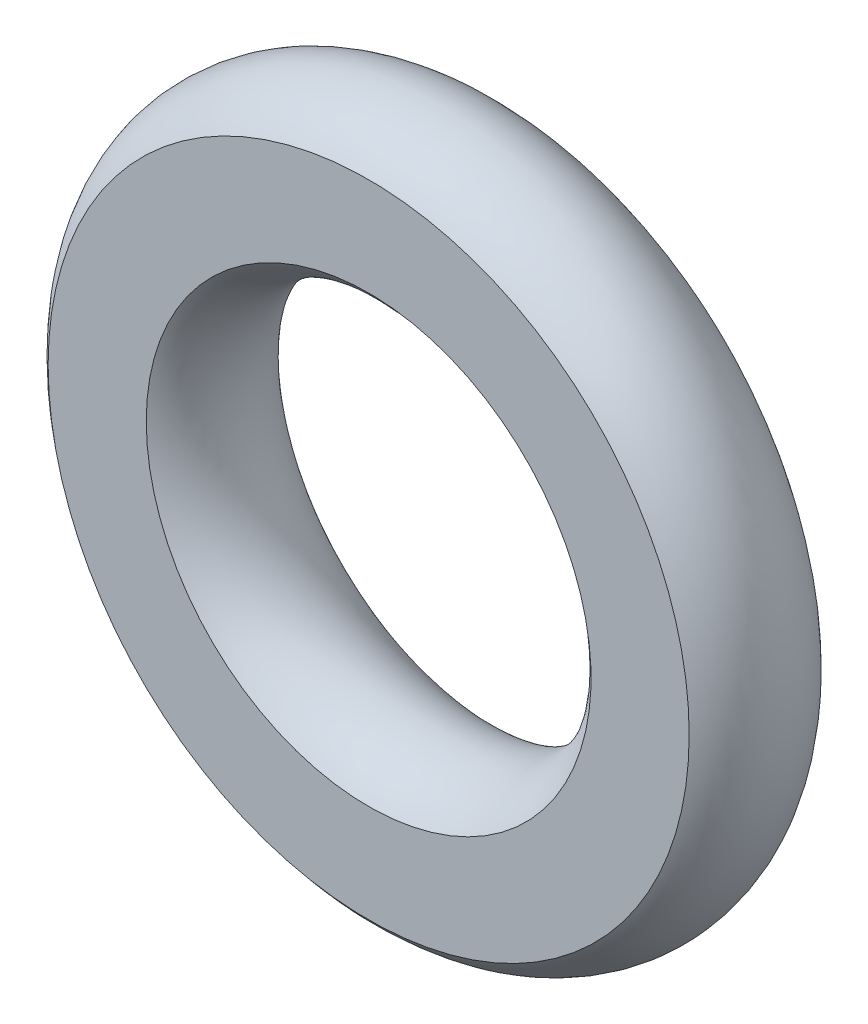
ISO-10303-21;
HEADER;
FILE_DESCRIPTION(('STEP AP214'),'2;1');
FILE_NAME('part.step','',(''),(''),'','','');
FILE_SCHEMA(('AUTOMOTIVE_DESIGN { 1 0 10303 214 1 1 1 1 }'));
ENDSEC;
DATA;
#1=APPLICATION_CONTEXT('core data for automotive mechanical design processes');
#2=APPLICATION_PROTOCOL_DEFINITION('international standard','automotive_design',2000,#1);
#3=PRODUCT_CONTEXT('',#1,'mechanical');
#4=PRODUCT('Part','Part','',(#3));
#5=PRODUCT_RELATED_PRODUCT_CATEGORY('part','',(#4));
#6=PRODUCT_DEFINITION_FORMATION('','',#4);
#7=PRODUCT_DEFINITION_CONTEXT('part definition',#1,'design');
#8=PRODUCT_DEFINITION('design','',#6,#7);
#9=PRODUCT_DEFINITION_SHAPE('','',#8);
#10=(LENGTH_UNIT() NAMED_UNIT(*) SI_UNIT(.MILLI.,.METRE.));
#11=(NAMED_UNIT(*) PLANE_ANGLE_UNIT() SI_UNIT($,.RADIAN.));
#12=(NAMED_UNIT(*) SI_UNIT($,.STERADIAN.) SOLID_ANGLE_UNIT());
#13=UNCERTAINTY_MEASURE_WITH_UNIT(LENGTH_MEASURE(1.E-05),#10,'distance_accuracy_value','');
#14=(GEOMETRIC_REPRESENTATION_CONTEXT(3) GLOBAL_UNCERTAINTY_ASSIGNED_CONTEXT((#13)) GLOBAL_UNIT_ASSIGNED_CONTEXT((#10,
#11,#12)) REPRESENTATION_CONTEXT('',''));
#15=CARTESIAN_POINT('',(0.,0.,0.));
#16=DIRECTION('',(0.,0.,1.));
#17=DIRECTION('',(1.,0.,0.));
#18=AXIS2_PLACEMENT_3D('',#15,#16,#17);
#19=CARTESIAN_POINT('',(0.,0.,0.));
#20=DIRECTION('',(0.,0.,-1.));
#21=DIRECTION('',(-1.,0.,0.));
#22=AXIS2_PLACEMENT_3D('',#19,#20,#21);
#23=TOROIDAL_SURFACE('',#22,2.1082,0.635);
#24=CARTESIAN_POINT('',(0.,0.,0.508));
#25=DIRECTION('',(0.,0.,-1.));
#26=DIRECTION('',(-1.,0.,0.));
#27=AXIS2_PLACEMENT_3D('',#24,#25,#26);
#28=CIRCLE('',#27,1.7272);
#29=CARTESIAN_POINT('',(-1.7272,0.,0.508));
#30=VERTEX_POINT('',#29);
#31=EDGE_CURVE('E49',#30,#30,#28,.T.);
#32=ORIENTED_EDGE('',*,*,#31,.F.);
#33=EDGE_LOOP('',(#32));
#34=FACE_BOUND('',#33,.T.);
#35=CARTESIAN_POINT('',(0.,0.,0.508));
#36=DIRECTION('',(0.,0.,1.));
#37=DIRECTION('',(1.,0.,0.));
#38=AXIS2_PLACEMENT_3D('',#35,#36,#37);
#39=CIRCLE('',#38,2.4892);
#40=CARTESIAN_POINT('',(2.4892,0.,0.508));
#41=VERTEX_POINT('',#40);
#42=EDGE_CURVE('E10',#41,#41,#39,.T.);
#43=ORIENTED_EDGE('',*,*,#42,.F.);
#44=EDGE_LOOP('',(#43));
#45=FACE_BOUND('',#44,.T.);
#46=ADVANCED_FACE('F42',(#34,#45),#23,.T.);
#47=CARTESIAN_POINT('',(0.,0.,0.508));
#48=DIRECTION('',(0.,0.,1.));
#49=DIRECTION('',(1.,0.,0.));
#50=AXIS2_PLACEMENT_3D('',#47,#48,#49);
#51=PLANE('',#50);
#52=ORIENTED_EDGE('',*,*,#31,.T.);
#53=EDGE_LOOP('',(#52));
#54=FACE_BOUND('',#53,.T.);
#55=ORIENTED_EDGE('',*,*,#42,.T.);
#56=EDGE_LOOP('',(#55));
#57=FACE_BOUND('',#56,.T.);
#58=ADVANCED_FACE('F56',(#54,#57),#51,.T.);
#59=CLOSED_SHELL('',(#46,#58));
#60=MANIFOLD_SOLID_BREP('B2',#59);
#61=ADVANCED_BREP_SHAPE_REPRESENTATION('',(#18,#60),#14);
#62=SHAPE_DEFINITION_REPRESENTATION(#9,#61);
ENDSEC;
END-ISO-10303-21;
